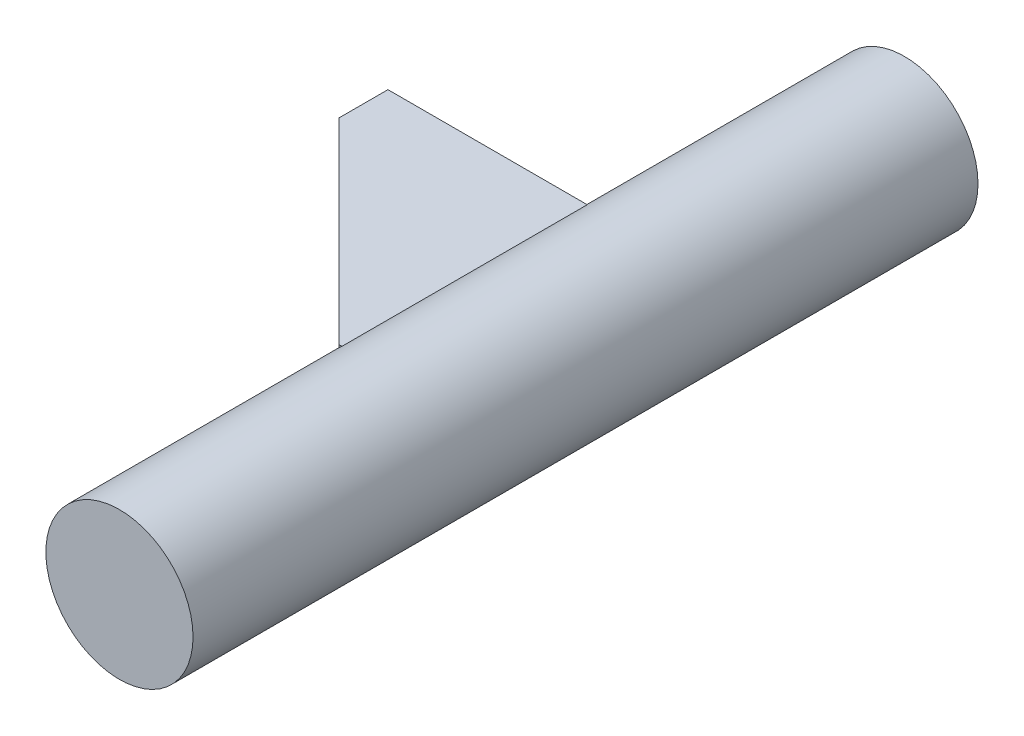
ISO-10303-21;
HEADER;
FILE_DESCRIPTION(('STEP AP214'),'2;1');
FILE_NAME('part.step','',(''),(''),'','','');
FILE_SCHEMA(('AUTOMOTIVE_DESIGN { 1 0 10303 214 1 1 1 1 }'));
ENDSEC;
DATA;
#1=APPLICATION_CONTEXT('core data for automotive mechanical design processes');
#2=APPLICATION_PROTOCOL_DEFINITION('international standard','automotive_design',2000,#1);
#3=PRODUCT_CONTEXT('',#1,'mechanical');
#4=PRODUCT('Part','Part','',(#3));
#5=PRODUCT_RELATED_PRODUCT_CATEGORY('part','',(#4));
#6=PRODUCT_DEFINITION_FORMATION('','',#4);
#7=PRODUCT_DEFINITION_CONTEXT('part definition',#1,'design');
#8=PRODUCT_DEFINITION('design','',#6,#7);
#9=PRODUCT_DEFINITION_SHAPE('','',#8);
#10=(LENGTH_UNIT() NAMED_UNIT(*) SI_UNIT(.MILLI.,.METRE.));
#11=(NAMED_UNIT(*) PLANE_ANGLE_UNIT() SI_UNIT($,.RADIAN.));
#12=(NAMED_UNIT(*) SI_UNIT($,.STERADIAN.) SOLID_ANGLE_UNIT());
#13=UNCERTAINTY_MEASURE_WITH_UNIT(LENGTH_MEASURE(1.E-05),#10,'distance_accuracy_value','');
#14=(GEOMETRIC_REPRESENTATION_CONTEXT(3) GLOBAL_UNCERTAINTY_ASSIGNED_CONTEXT((#13)) GLOBAL_UNIT_ASSIGNED_CONTEXT((#10,
#11,#12)) REPRESENTATION_CONTEXT('',''));
#15=CARTESIAN_POINT('',(0.,0.,0.));
#16=DIRECTION('',(0.,0.,1.));
#17=DIRECTION('',(1.,0.,0.));
#18=AXIS2_PLACEMENT_3D('',#15,#16,#17);
#19=CARTESIAN_POINT('',(0.,0.,16.));
#20=DIRECTION('',(0.,0.,-1.));
#21=DIRECTION('',(-1.,0.,0.));
#22=AXIS2_PLACEMENT_3D('',#19,#20,#21);
#23=CYLINDRICAL_SURFACE('',#22,3.);
#24=DIRECTION('',(0.,0.,-1.));
#25=VECTOR('',#24,1.);
#26=CARTESIAN_POINT('',(-1.92924095373072,2.29739620928742,16.));
#27=LINE('',#26,#25);
#28=CARTESIAN_POINT('',(-1.92924095373072,2.29739620928742,5.));
#29=VERTEX_POINT('',#28);
#30=CARTESIAN_POINT('',(-1.92924095373072,2.29739620928742,-5.));
#31=VERTEX_POINT('',#30);
#32=EDGE_CURVE('E109',#29,#31,#27,.T.);
#33=ORIENTED_EDGE('',*,*,#32,.F.);
#34=CARTESIAN_POINT('',(0.,0.,5.));
#35=DIRECTION('',(0.,0.,1.));
#36=DIRECTION('',(1.,0.,0.));
#37=AXIS2_PLACEMENT_3D('',#34,#35,#36);
#38=CIRCLE('',#37,3.);
#39=CARTESIAN_POINT('',(-2.05446006258367,2.18613674120552,5.));
#40=VERTEX_POINT('',#39);
#41=EDGE_CURVE('E114',#29,#40,#38,.T.);
#42=ORIENTED_EDGE('',*,*,#41,.T.);
#43=CARTESIAN_POINT('',(0.,0.,7.05446006258365));
#44=DIRECTION('',(-0.707106781186544,0.,0.707106781186551));
#45=DIRECTION('',(-0.707106781186551,0.,-0.707106781186544));
#46=AXIS2_PLACEMENT_3D('',#43,#44,#45);
#47=ELLIPSE('',#46,4.24264068711926,3.);
#48=CARTESIAN_POINT('',(-2.16524464644593,-2.07646710088006,4.88921541613774));
#49=VERTEX_POINT('',#48);
#50=EDGE_CURVE('E11',#40,#49,#47,.T.);
#51=ORIENTED_EDGE('',*,*,#50,.T.);
#52=DIRECTION('',(0.,0.,-1.));
#53=VECTOR('',#52,1.);
#54=CARTESIAN_POINT('',(-2.16524464644593,-2.07646710088006,16.));
#55=LINE('',#54,#53);
#56=CARTESIAN_POINT('',(-2.16524464644593,-2.07646710088006,-5.));
#57=VERTEX_POINT('',#56);
#58=EDGE_CURVE('E112',#57,#49,#55,.F.);
#59=ORIENTED_EDGE('',*,*,#58,.F.);
#60=CARTESIAN_POINT('',(0.,0.,-5.));
#61=DIRECTION('',(0.,0.,1.));
#62=DIRECTION('',(1.,0.,0.));
#63=AXIS2_PLACEMENT_3D('',#60,#61,#62);
#64=CIRCLE('',#63,3.);
#65=EDGE_CURVE('E92',#31,#57,#64,.T.);
#66=ORIENTED_EDGE('',*,*,#65,.F.);
#67=EDGE_LOOP('',(#33,#42,#51,#59,#66));
#68=FACE_BOUND('',#67,.T.);
#69=CARTESIAN_POINT('',(0.,0.,16.));
#70=DIRECTION('',(0.,0.,1.));
#71=DIRECTION('',(1.,0.,0.));
#72=AXIS2_PLACEMENT_3D('',#69,#70,#71);
#73=CIRCLE('',#72,3.);
#74=CARTESIAN_POINT('',(3.,0.,16.));
#75=VERTEX_POINT('',#74);
#76=EDGE_CURVE('E103',#75,#75,#73,.T.);
#77=ORIENTED_EDGE('',*,*,#76,.F.);
#78=EDGE_LOOP('',(#77));
#79=FACE_BOUND('',#78,.T.);
#80=CARTESIAN_POINT('',(0.,0.,-16.));
#81=DIRECTION('',(0.,0.,1.));
#82=DIRECTION('',(1.,0.,0.));
#83=AXIS2_PLACEMENT_3D('',#80,#81,#82);
#84=CIRCLE('',#83,3.);
#85=CARTESIAN_POINT('',(3.,0.,-16.));
#86=VERTEX_POINT('',#85);
#87=EDGE_CURVE('E83',#86,#86,#84,.T.);
#88=ORIENTED_EDGE('',*,*,#87,.T.);
#89=EDGE_LOOP('',(#88));
#90=FACE_BOUND('',#89,.T.);
#91=ADVANCED_FACE('F33',(#68,#79,#90),#23,.T.);
#92=CARTESIAN_POINT('',(0.,0.,16.));
#93=DIRECTION('',(0.,0.,1.));
#94=DIRECTION('',(1.,0.,0.));
#95=AXIS2_PLACEMENT_3D('',#92,#93,#94);
#96=PLANE('',#95);
#97=ORIENTED_EDGE('',*,*,#76,.T.);
#98=EDGE_LOOP('',(#97));
#99=FACE_BOUND('',#98,.T.);
#100=ADVANCED_FACE('F134',(#99),#96,.T.);
#101=CARTESIAN_POINT('',(0.,0.,-16.));
#102=DIRECTION('',(0.,0.,1.));
#103=DIRECTION('',(1.,0.,0.));
#104=AXIS2_PLACEMENT_3D('',#101,#102,#103);
#105=PLANE('',#104);
#106=ORIENTED_EDGE('',*,*,#87,.F.);
#107=EDGE_LOOP('',(#106));
#108=FACE_BOUND('',#107,.T.);
#109=ADVANCED_FACE('F139',(#108),#105,.F.);
#110=CARTESIAN_POINT('',(-10.0544600625838,-2.07646710088006,5.));
#111=DIRECTION('',(0.,1.,0.));
#112=DIRECTION('',(0.,0.,1.));
#113=AXIS2_PLACEMENT_3D('',#110,#111,#112);
#114=PLANE('',#113);
#115=ORIENTED_EDGE('',*,*,#58,.T.);
#116=DIRECTION('',(-0.707106781186551,0.,-0.707106781186544));
#117=VECTOR('',#116,1.);
#118=CARTESIAN_POINT('',(-2.05446006258367,-2.07646710088006,5.));
#119=LINE('',#118,#117);
#120=CARTESIAN_POINT('',(-10.0544600625838,-2.07646710088006,-3.00000000000006));
#121=VERTEX_POINT('',#120);
#122=EDGE_CURVE('E56',#49,#121,#119,.T.);
#123=ORIENTED_EDGE('',*,*,#122,.T.);
#124=DIRECTION('',(0.,0.,-1.));
#125=VECTOR('',#124,1.);
#126=CARTESIAN_POINT('',(-10.0544600625838,-2.07646710088006,5.));
#127=LINE('',#126,#125);
#128=CARTESIAN_POINT('',(-10.0544600625838,-2.07646710088006,-5.));
#129=VERTEX_POINT('',#128);
#130=EDGE_CURVE('E78',#121,#129,#127,.T.);
#131=ORIENTED_EDGE('',*,*,#130,.T.);
#132=DIRECTION('',(1.,0.,0.));
#133=VECTOR('',#132,1.);
#134=CARTESIAN_POINT('',(-10.0544600625838,-2.07646710088006,-5.));
#135=LINE('',#134,#133);
#136=EDGE_CURVE('E81',#129,#57,#135,.T.);
#137=ORIENTED_EDGE('',*,*,#136,.T.);
#138=EDGE_LOOP('',(#115,#123,#131,#137));
#139=FACE_BOUND('',#138,.T.);
#140=ADVANCED_FACE('F80',(#139),#114,.F.);
#141=CARTESIAN_POINT('',(-10.0544600625838,2.29739620928742,5.));
#142=DIRECTION('',(0.,-1.,0.));
#143=DIRECTION('',(0.,0.,-1.));
#144=AXIS2_PLACEMENT_3D('',#141,#142,#143);
#145=PLANE('',#144);
#146=DIRECTION('',(0.,0.,-1.));
#147=VECTOR('',#146,1.);
#148=CARTESIAN_POINT('',(-10.0544600625838,2.29739620928742,5.));
#149=LINE('',#148,#147);
#150=CARTESIAN_POINT('',(-10.0544600625838,2.29739620928742,-3.00000000000006));
#151=VERTEX_POINT('',#150);
#152=CARTESIAN_POINT('',(-10.0544600625838,2.29739620928742,-5.));
#153=VERTEX_POINT('',#152);
#154=EDGE_CURVE('E84',#151,#153,#149,.T.);
#155=ORIENTED_EDGE('',*,*,#154,.F.);
#156=DIRECTION('',(0.707106781186551,0.,0.707106781186544));
#157=VECTOR('',#156,1.);
#158=CARTESIAN_POINT('',(-2.05446006258367,2.29739620928742,5.));
#159=LINE('',#158,#157);
#160=CARTESIAN_POINT('',(-2.05446006258367,2.29739620928742,5.));
#161=VERTEX_POINT('',#160);
#162=EDGE_CURVE('E41',#151,#161,#159,.T.);
#163=ORIENTED_EDGE('',*,*,#162,.T.);
#164=DIRECTION('',(-1.,0.,0.));
#165=VECTOR('',#164,1.);
#166=CARTESIAN_POINT('',(-10.0544600625838,2.29739620928742,5.));
#167=LINE('',#166,#165);
#168=EDGE_CURVE('E99',#29,#161,#167,.T.);
#169=ORIENTED_EDGE('',*,*,#168,.F.);
#170=ORIENTED_EDGE('',*,*,#32,.T.);
#171=DIRECTION('',(-1.,0.,0.));
#172=VECTOR('',#171,1.);
#173=CARTESIAN_POINT('',(-10.0544600625838,2.29739620928742,-5.));
#174=LINE('',#173,#172);
#175=EDGE_CURVE('E93',#31,#153,#174,.T.);
#176=ORIENTED_EDGE('',*,*,#175,.T.);
#177=EDGE_LOOP('',(#155,#163,#169,#170,#176));
#178=FACE_BOUND('',#177,.T.);
#179=ADVANCED_FACE('F125',(#178),#145,.F.);
#180=CARTESIAN_POINT('',(-10.0544600625838,2.29739620928742,5.));
#181=DIRECTION('',(1.,0.,0.));
#182=DIRECTION('',(0.,0.,-1.));
#183=AXIS2_PLACEMENT_3D('',#180,#181,#182);
#184=PLANE('',#183);
#185=ORIENTED_EDGE('',*,*,#130,.F.);
#186=DIRECTION('',(0.,1.,0.));
#187=VECTOR('',#186,1.);
#188=CARTESIAN_POINT('',(-10.0544600625838,2.29739620928742,-3.00000000000006));
#189=LINE('',#188,#187);
#190=EDGE_CURVE('E48',#121,#151,#189,.T.);
#191=ORIENTED_EDGE('',*,*,#190,.T.);
#192=ORIENTED_EDGE('',*,*,#154,.T.);
#193=DIRECTION('',(0.,-1.,0.));
#194=VECTOR('',#193,1.);
#195=CARTESIAN_POINT('',(-10.0544600625838,2.29739620928742,-5.));
#196=LINE('',#195,#194);
#197=EDGE_CURVE('E91',#153,#129,#196,.T.);
#198=ORIENTED_EDGE('',*,*,#197,.T.);
#199=EDGE_LOOP('',(#185,#191,#192,#198));
#200=FACE_BOUND('',#199,.T.);
#201=ADVANCED_FACE('F95',(#200),#184,.F.);
#202=CARTESIAN_POINT('',(0.,0.,5.));
#203=DIRECTION('',(0.,0.,1.));
#204=DIRECTION('',(1.,0.,0.));
#205=AXIS2_PLACEMENT_3D('',#202,#203,#204);
#206=PLANE('',#205);
#207=ORIENTED_EDGE('',*,*,#168,.T.);
#208=DIRECTION('',(0.,-1.,0.));
#209=VECTOR('',#208,1.);
#210=CARTESIAN_POINT('',(-2.05446006258367,-2.07646710088006,5.));
#211=LINE('',#210,#209);
#212=EDGE_CURVE('E117',#161,#40,#211,.T.);
#213=ORIENTED_EDGE('',*,*,#212,.T.);
#214=ORIENTED_EDGE('',*,*,#41,.F.);
#215=EDGE_LOOP('',(#207,#213,#214));
#216=FACE_BOUND('',#215,.T.);
#217=ADVANCED_FACE('F130',(#216),#206,.T.);
#218=CARTESIAN_POINT('',(0.,0.,-5.));
#219=DIRECTION('',(0.,0.,1.));
#220=DIRECTION('',(1.,0.,0.));
#221=AXIS2_PLACEMENT_3D('',#218,#219,#220);
#222=PLANE('',#221);
#223=ORIENTED_EDGE('',*,*,#175,.F.);
#224=ORIENTED_EDGE('',*,*,#65,.T.);
#225=ORIENTED_EDGE('',*,*,#136,.F.);
#226=ORIENTED_EDGE('',*,*,#197,.F.);
#227=EDGE_LOOP('',(#223,#224,#225,#226));
#228=FACE_BOUND('',#227,.T.);
#229=ADVANCED_FACE('F90',(#228),#222,.F.);
#230=CARTESIAN_POINT('',(-2.05446006258367,0.,5.));
#231=DIRECTION('',(-0.707106781186544,0.,0.707106781186551));
#232=DIRECTION('',(0.,1.,0.));
#233=AXIS2_PLACEMENT_3D('',#230,#231,#232);
#234=PLANE('',#233);
#235=ORIENTED_EDGE('',*,*,#162,.F.);
#236=ORIENTED_EDGE('',*,*,#190,.F.);
#237=ORIENTED_EDGE('',*,*,#122,.F.);
#238=ORIENTED_EDGE('',*,*,#50,.F.);
#239=ORIENTED_EDGE('',*,*,#212,.F.);
#240=EDGE_LOOP('',(#235,#236,#237,#238,#239));
#241=FACE_BOUND('',#240,.T.);
#242=ADVANCED_FACE('F35',(#241),#234,.T.);
#243=CLOSED_SHELL('',(#91,#100,#109,#140,#179,#201,#217,#229,#242));
#244=MANIFOLD_SOLID_BREP('B2',#243);
#245=ADVANCED_BREP_SHAPE_REPRESENTATION('',(#18,#244),#14);
#246=SHAPE_DEFINITION_REPRESENTATION(#9,#245);
ENDSEC;
END-ISO-10303-21;
